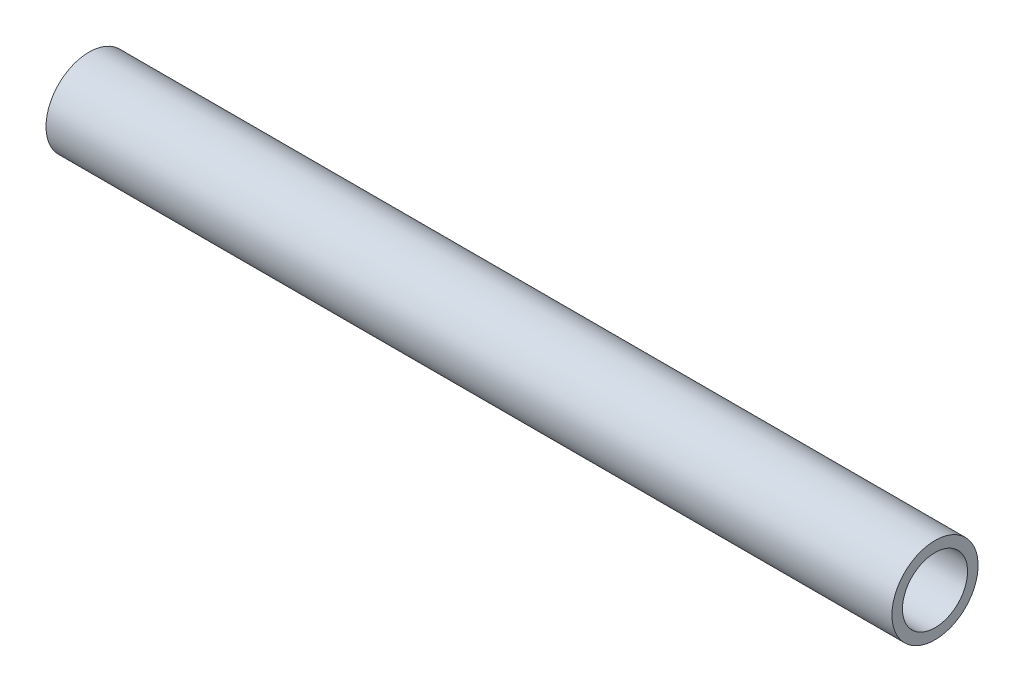
ISO-10303-21;
HEADER;
FILE_DESCRIPTION(('STEP AP214'),'2;1');
FILE_NAME('part.step','',(''),(''),'','','');
FILE_SCHEMA(('AUTOMOTIVE_DESIGN { 1 0 10303 214 1 1 1 1 }'));
ENDSEC;
DATA;
#1=APPLICATION_CONTEXT('core data for automotive mechanical design processes');
#2=APPLICATION_PROTOCOL_DEFINITION('international standard','automotive_design',2000,#1);
#3=PRODUCT_CONTEXT('',#1,'mechanical');
#4=PRODUCT('Part','Part','',(#3));
#5=PRODUCT_RELATED_PRODUCT_CATEGORY('part','',(#4));
#6=PRODUCT_DEFINITION_FORMATION('','',#4);
#7=PRODUCT_DEFINITION_CONTEXT('part definition',#1,'design');
#8=PRODUCT_DEFINITION('design','',#6,#7);
#9=PRODUCT_DEFINITION_SHAPE('','',#8);
#10=(LENGTH_UNIT() NAMED_UNIT(*) SI_UNIT(.MILLI.,.METRE.));
#11=(NAMED_UNIT(*) PLANE_ANGLE_UNIT() SI_UNIT($,.RADIAN.));
#12=(NAMED_UNIT(*) SI_UNIT($,.STERADIAN.) SOLID_ANGLE_UNIT());
#13=UNCERTAINTY_MEASURE_WITH_UNIT(LENGTH_MEASURE(1.E-05),#10,'distance_accuracy_value','');
#14=(GEOMETRIC_REPRESENTATION_CONTEXT(3) GLOBAL_UNCERTAINTY_ASSIGNED_CONTEXT((#13)) GLOBAL_UNIT_ASSIGNED_CONTEXT((#10,
#11,#12)) REPRESENTATION_CONTEXT('',''));
#15=CARTESIAN_POINT('',(0.,0.,0.));
#16=DIRECTION('',(0.,0.,1.));
#17=DIRECTION('',(1.,0.,0.));
#18=AXIS2_PLACEMENT_3D('',#15,#16,#17);
#19=CARTESIAN_POINT('',(-1000.,0.,0.));
#20=DIRECTION('',(-1.,0.,0.));
#21=DIRECTION('',(0.,0.,1.));
#22=AXIS2_PLACEMENT_3D('',#19,#20,#21);
#23=CYLINDRICAL_SURFACE('',#22,6.35);
#24=CARTESIAN_POINT('',(82.5,0.,0.));
#25=DIRECTION('',(-1.,0.,0.));
#26=DIRECTION('',(0.,0.,1.));
#27=AXIS2_PLACEMENT_3D('',#24,#25,#26);
#28=CIRCLE('',#27,6.35);
#29=CARTESIAN_POINT('',(82.5,0.,6.35));
#30=VERTEX_POINT('',#29);
#31=EDGE_CURVE('E52',#30,#30,#28,.T.);
#32=ORIENTED_EDGE('',*,*,#31,.F.);
#33=EDGE_LOOP('',(#32));
#34=FACE_BOUND('',#33,.T.);
#35=CARTESIAN_POINT('',(-82.5,0.,0.));
#36=DIRECTION('',(-1.,0.,0.));
#37=DIRECTION('',(0.,0.,1.));
#38=AXIS2_PLACEMENT_3D('',#35,#36,#37);
#39=CIRCLE('',#38,6.35);
#40=CARTESIAN_POINT('',(-82.5,0.,6.35));
#41=VERTEX_POINT('',#40);
#42=EDGE_CURVE('E10',#41,#41,#39,.T.);
#43=ORIENTED_EDGE('',*,*,#42,.T.);
#44=EDGE_LOOP('',(#43));
#45=FACE_BOUND('',#44,.T.);
#46=ADVANCED_FACE('F39',(#34,#45),#23,.F.);
#47=CARTESIAN_POINT('',(-82.5,6.35,0.));
#48=DIRECTION('',(1.,0.,0.));
#49=DIRECTION('',(0.,0.,-1.));
#50=AXIS2_PLACEMENT_3D('',#47,#48,#49);
#51=PLANE('',#50);
#52=ORIENTED_EDGE('',*,*,#42,.F.);
#53=EDGE_LOOP('',(#52));
#54=FACE_BOUND('',#53,.T.);
#55=CARTESIAN_POINT('',(-82.5,0.,0.));
#56=DIRECTION('',(-1.,0.,0.));
#57=DIRECTION('',(0.,0.,1.));
#58=AXIS2_PLACEMENT_3D('',#55,#56,#57);
#59=CIRCLE('',#58,8.4);
#60=CARTESIAN_POINT('',(-82.5,0.,8.4));
#61=VERTEX_POINT('',#60);
#62=EDGE_CURVE('E44',#61,#61,#59,.T.);
#63=ORIENTED_EDGE('',*,*,#62,.T.);
#64=EDGE_LOOP('',(#63));
#65=FACE_BOUND('',#64,.T.);
#66=ADVANCED_FACE('F65',(#54,#65),#51,.F.);
#67=CARTESIAN_POINT('',(-1000.,0.,0.));
#68=DIRECTION('',(-1.,0.,0.));
#69=DIRECTION('',(0.,0.,1.));
#70=AXIS2_PLACEMENT_3D('',#67,#68,#69);
#71=CYLINDRICAL_SURFACE('',#70,8.4);
#72=ORIENTED_EDGE('',*,*,#62,.F.);
#73=EDGE_LOOP('',(#72));
#74=FACE_BOUND('',#73,.T.);
#75=CARTESIAN_POINT('',(82.5,0.,0.));
#76=DIRECTION('',(-1.,0.,0.));
#77=DIRECTION('',(0.,0.,1.));
#78=AXIS2_PLACEMENT_3D('',#75,#76,#77);
#79=CIRCLE('',#78,8.4);
#80=CARTESIAN_POINT('',(82.5,0.,8.4));
#81=VERTEX_POINT('',#80);
#82=EDGE_CURVE('E47',#81,#81,#79,.T.);
#83=ORIENTED_EDGE('',*,*,#82,.T.);
#84=EDGE_LOOP('',(#83));
#85=FACE_BOUND('',#84,.T.);
#86=ADVANCED_FACE('F67',(#74,#85),#71,.T.);
#87=CARTESIAN_POINT('',(82.5,8.4,0.));
#88=DIRECTION('',(-1.,0.,0.));
#89=DIRECTION('',(0.,0.,1.));
#90=AXIS2_PLACEMENT_3D('',#87,#88,#89);
#91=PLANE('',#90);
#92=ORIENTED_EDGE('',*,*,#82,.F.);
#93=EDGE_LOOP('',(#92));
#94=FACE_BOUND('',#93,.T.);
#95=ORIENTED_EDGE('',*,*,#31,.T.);
#96=EDGE_LOOP('',(#95));
#97=FACE_BOUND('',#96,.T.);
#98=ADVANCED_FACE('F56',(#94,#97),#91,.F.);
#99=CLOSED_SHELL('',(#46,#66,#86,#98));
#100=MANIFOLD_SOLID_BREP('B2',#99);
#101=ADVANCED_BREP_SHAPE_REPRESENTATION('',(#18,#100),#14);
#102=SHAPE_DEFINITION_REPRESENTATION(#9,#101);
ENDSEC;
END-ISO-10303-21;
